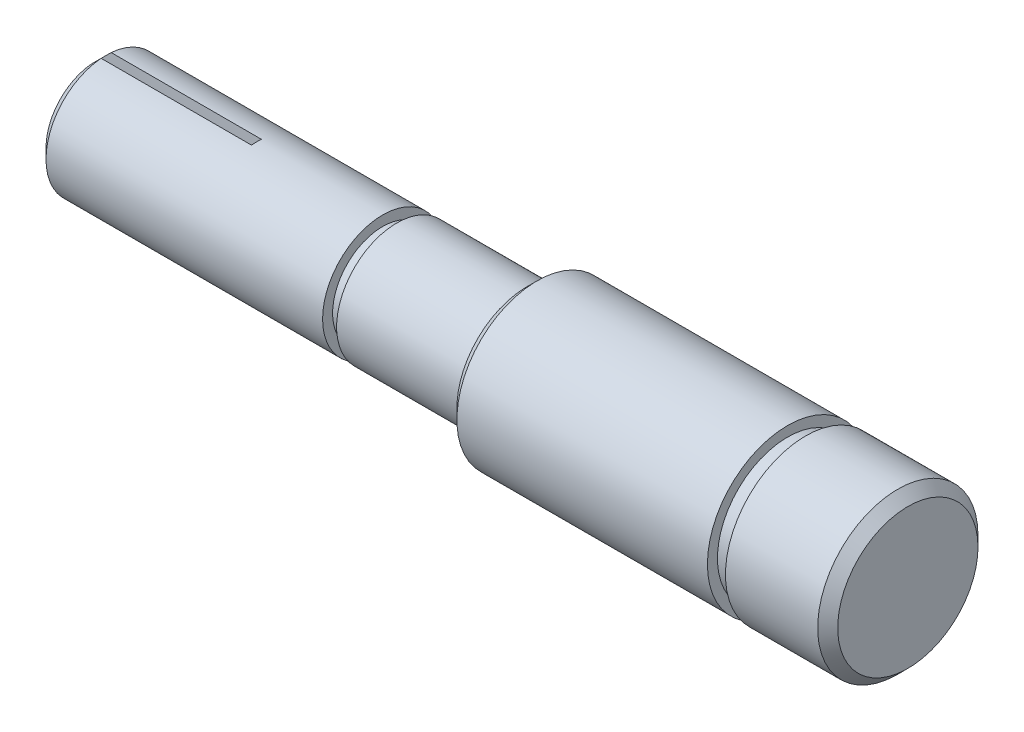
ISO-10303-21;
HEADER;
FILE_DESCRIPTION(('STEP AP214'),'2;1');
FILE_NAME('part.step','',(''),(''),'','','');
FILE_SCHEMA(('AUTOMOTIVE_DESIGN { 1 0 10303 214 1 1 1 1 }'));
ENDSEC;
DATA;
#1=APPLICATION_CONTEXT('core data for automotive mechanical design processes');
#2=APPLICATION_PROTOCOL_DEFINITION('international standard','automotive_design',2000,#1);
#3=PRODUCT_CONTEXT('',#1,'mechanical');
#4=PRODUCT('Part','Part','',(#3));
#5=PRODUCT_RELATED_PRODUCT_CATEGORY('part','',(#4));
#6=PRODUCT_DEFINITION_FORMATION('','',#4);
#7=PRODUCT_DEFINITION_CONTEXT('part definition',#1,'design');
#8=PRODUCT_DEFINITION('design','',#6,#7);
#9=PRODUCT_DEFINITION_SHAPE('','',#8);
#10=(LENGTH_UNIT() NAMED_UNIT(*) SI_UNIT(.MILLI.,.METRE.));
#11=(NAMED_UNIT(*) PLANE_ANGLE_UNIT() SI_UNIT($,.RADIAN.));
#12=(NAMED_UNIT(*) SI_UNIT($,.STERADIAN.) SOLID_ANGLE_UNIT());
#13=UNCERTAINTY_MEASURE_WITH_UNIT(LENGTH_MEASURE(1.E-05),#10,'distance_accuracy_value','');
#14=(GEOMETRIC_REPRESENTATION_CONTEXT(3) GLOBAL_UNCERTAINTY_ASSIGNED_CONTEXT((#13)) GLOBAL_UNIT_ASSIGNED_CONTEXT((#10,
#11,#12)) REPRESENTATION_CONTEXT('',''));
#15=CARTESIAN_POINT('',(0.,0.,0.));
#16=DIRECTION('',(0.,0.,1.));
#17=DIRECTION('',(1.,0.,0.));
#18=AXIS2_PLACEMENT_3D('',#15,#16,#17);
#19=CARTESIAN_POINT('',(-21.5,0.,0.));
#20=DIRECTION('',(1.,0.,0.));
#21=DIRECTION('',(0.,0.,-1.));
#22=AXIS2_PLACEMENT_3D('',#19,#20,#21);
#23=CONICAL_SURFACE('',#22,2.5,0.785398163397448);
#24=CARTESIAN_POINT('',(-21.,0.,0.));
#25=DIRECTION('',(1.,0.,0.));
#26=DIRECTION('',(0.,0.,-1.));
#27=AXIS2_PLACEMENT_3D('',#24,#25,#26);
#28=CIRCLE('',#27,3.);
#29=CARTESIAN_POINT('',(-21.,2.98956518577535,0.250000000000004));
#30=VERTEX_POINT('',#29);
#31=CARTESIAN_POINT('',(-21.,-2.98956518577535,0.250000000000004));
#32=VERTEX_POINT('',#31);
#33=EDGE_CURVE('E228',#30,#32,#28,.T.);
#34=ORIENTED_EDGE('',*,*,#33,.F.);
#35=CARTESIAN_POINT('',(-20.9993,2.9902676284908,0.250000000000004));
#36=CARTESIAN_POINT('',(-21.105645963465,2.88354717231607,0.250000000000004));
#37=CARTESIAN_POINT('',(-21.2119753631983,2.77681018083753,0.250000000000004));
#38=CARTESIAN_POINT('',(-21.4245834325751,2.56327423349095,0.250000000000004));
#39=CARTESIAN_POINT('',(-21.5308620991754,2.45647527459325,0.250000000000004));
#40=CARTESIAN_POINT('',(-21.7434767398393,2.24266011461647,0.250000000000004));
#41=CARTESIAN_POINT('',(-21.8498126108472,2.13564381105248,0.250000000000004));
#42=CARTESIAN_POINT('',(-22.0623554592259,1.92149432900575,0.250000000000004));
#43=CARTESIAN_POINT('',(-22.1685624430605,1.81436115694293,0.250000000000004));
#44=CARTESIAN_POINT('',(-22.3747364463565,1.60598729070477,0.250000000000004));
#45=CARTESIAN_POINT('',(-22.4747149031306,1.50475791122002,0.250000000000004));
#46=CARTESIAN_POINT('',(-22.6743690359422,1.30197014758938,0.250000000000004));
#47=CARTESIAN_POINT('',(-22.7740446642128,1.20041171628052,0.250000000000004));
#48=CARTESIAN_POINT('',(-22.9230171326216,1.04762350697907,0.250000000000004));
#49=CARTESIAN_POINT('',(-22.972565318899,0.996638901226536,0.250000000000004));
#50=CARTESIAN_POINT('',(-23.0714006562001,0.894410835579374,0.250000000000004));
#51=CARTESIAN_POINT('',(-23.1206877922016,0.843167361112515,0.250000000000004));
#52=CARTESIAN_POINT('',(-23.2188054598471,0.740272773730992,0.250000000000004));
#53=CARTESIAN_POINT('',(-23.2676361148001,0.688621778285208,0.250000000000004));
#54=CARTESIAN_POINT('',(-23.3645022948835,0.58458100683293,0.250000000000004));
#55=CARTESIAN_POINT('',(-23.4125379181739,0.532191323531495,0.250000000000004));
#56=CARTESIAN_POINT('',(-23.472835835936,0.464162293825563,0.250000000000004));
#57=CARTESIAN_POINT('',(-23.4859226134034,0.449257017395822,0.250000000000004));
#58=CARTESIAN_POINT('',(-23.511903307144,0.419277890756481,0.250000000000004));
#59=CARTESIAN_POINT('',(-23.5247972040769,0.40420402390347,0.250000000000004));
#60=CARTESIAN_POINT('',(-23.5633586086666,0.358382247513215,0.250000000000004));
#61=CARTESIAN_POINT('',(-23.5886555582303,0.327312762945882,0.250000000000004));
#62=CARTESIAN_POINT('',(-23.6252382522476,0.27937697350762,0.250000000000004));
#63=CARTESIAN_POINT('',(-23.6372682333789,0.263082275343485,0.250000000000004));
#64=CARTESIAN_POINT('',(-23.6605395199735,0.229943029382785,0.250000000000004));
#65=CARTESIAN_POINT('',(-23.6717812008072,0.213098748961249,0.250000000000004));
#66=CARTESIAN_POINT('',(-23.692948155577,0.178779798046501,0.250000000000004));
#67=CARTESIAN_POINT('',(-23.7028835753176,0.161311515415135,0.250000000000004));
#68=CARTESIAN_POINT('',(-23.7207464504694,0.125398009318636,0.250000000000004));
#69=CARTESIAN_POINT('',(-23.728679850279,0.106955879401266,0.250000000000004));
#70=CARTESIAN_POINT('',(-23.7407373861175,0.0705858498257445,0.250000000000004));
#71=CARTESIAN_POINT('',(-23.7451342674538,0.0527543486405554,0.250000000000004));
#72=CARTESIAN_POINT('',(-23.7500737813293,0.0166357412634052,0.250000000000004));
#73=CARTESIAN_POINT('',(-23.7506414543594,-0.00164761864048112,0.250000000000004));
#74=CARTESIAN_POINT('',(-23.7478030329323,-0.0378228582444066,0.250000000000004));
#75=CARTESIAN_POINT('',(-23.744407646743,-0.0557156604188548,0.250000000000004));
#76=CARTESIAN_POINT('',(-23.7345832748863,-0.090744359528676,0.250000000000004));
#77=CARTESIAN_POINT('',(-23.7281292768153,-0.107872717633599,0.250000000000004));
#78=CARTESIAN_POINT('',(-23.7144440025326,-0.138562346567691,0.250000000000004));
#79=CARTESIAN_POINT('',(-23.7074996814289,-0.152257626430681,0.250000000000004));
#80=CARTESIAN_POINT('',(-23.6926545987555,-0.179125666838547,0.250000000000004));
#81=CARTESIAN_POINT('',(-23.6847531211403,-0.192298026285365,0.250000000000004));
#82=CARTESIAN_POINT('',(-23.6600273622829,-0.231281435604873,0.250000000000004));
#83=CARTESIAN_POINT('',(-23.6422283688442,-0.256466072633681,0.250000000000004));
#84=CARTESIAN_POINT('',(-23.60516056709,-0.306049112889524,0.250000000000004));
#85=CARTESIAN_POINT('',(-23.5858799223633,-0.330438346273076,0.250000000000004));
#86=CARTESIAN_POINT('',(-23.54658106566,-0.378521417099532,0.250000000000004));
#87=CARTESIAN_POINT('',(-23.526564611432,-0.402216696148967,0.250000000000004));
#88=CARTESIAN_POINT('',(-23.4666751471882,-0.471685248942617,0.250000000000004));
#89=CARTESIAN_POINT('',(-23.4261362735594,-0.516879799009654,0.250000000000004));
#90=CARTESIAN_POINT('',(-23.3442258007109,-0.606512128707194,0.250000000000004));
#91=CARTESIAN_POINT('',(-23.3028540504337,-0.650949768310156,0.250000000000004));
#92=CARTESIAN_POINT('',(-23.2195907474666,-0.739434846645634,0.250000000000004));
#93=CARTESIAN_POINT('',(-23.1776986357934,-0.783481759281574,0.250000000000004));
#94=CARTESIAN_POINT('',(-23.0936325608451,-0.871297933709806,0.250000000000004));
#95=CARTESIAN_POINT('',(-23.0514586209597,-0.915067217969552,0.250000000000004));
#96=CARTESIAN_POINT('',(-22.9254318394301,-1.04531491722678,0.250000000000004));
#97=CARTESIAN_POINT('',(-22.8413115903939,-1.13153440795978,0.250000000000004));
#98=CARTESIAN_POINT('',(-22.6727605317382,-1.30359134564105,0.250000000000004));
#99=CARTESIAN_POINT('',(-22.5883298806817,-1.38942894844638,0.250000000000004));
#100=CARTESIAN_POINT('',(-22.3795603854613,-1.60117963916256,0.250000000000004));
#101=CARTESIAN_POINT('',(-22.2551047929327,-1.72697761830093,0.250000000000004));
#102=CARTESIAN_POINT('',(-22.0059548291957,-1.97838000922704,0.250000000000004));
#103=CARTESIAN_POINT('',(-21.8812604201732,-2.10398438348348,0.250000000000004));
#104=CARTESIAN_POINT('',(-21.63039117078,-2.35642720390123,0.250000000000004));
#105=CARTESIAN_POINT('',(-21.5042149370849,-2.48326426543281,0.250000000000004));
#106=CARTESIAN_POINT('',(-21.2517992913905,-2.73683025270886,0.250000000000004));
#107=CARTESIAN_POINT('',(-21.1255598947718,-2.86355919376233,0.250000000000004));
#108=CARTESIAN_POINT('',(-20.9993,-2.9902676284908,0.250000000000004));
#109=B_SPLINE_CURVE_WITH_KNOTS('',3,(#35,#36,#37,#38,#39,#40,#41,#42,#43,#44,#45,#46,#47,#48,
#49,#50,#51,#52,#53,#54,#55,#56,#57,#58,#59,#60,#61,#62,#63,#64,#65,#66,#67,#68,#69,#70,#71,#72,
#73,#74,#75,#76,#77,#78,#79,#80,#81,#82,#83,#84,#85,#86,#87,#88,#89,#90,#91,#92,#93,#94,#95,#96,
#97,#98,#99,#100,#101,#102,#103,#104,#105,#106,#107,#108),.UNSPECIFIED.,.F.,.F.,(4,2,2,2,2,2,2,
2,2,2,2,2,2,2,2,2,2,2,2,2,2,2,2,2,2,2,2,2,2,2,2,2,2,2,2,2,4),(0.,0.45198286086596,
0.903990082435561,1.35658065177219,1.80914749886992,2.23598189484333,2.66288044451171,
2.87616409412312,3.08945988673875,3.30269629260739,3.51590617145908,3.57540954944727,
3.63491885444813,3.75506085917041,3.81580973111918,3.87652947659987,3.93674556704951,
3.99678070249662,4.0515584273213,4.10597759180221,4.16025005432108,4.21497420761324,
4.26099326898474,4.30704697217485,4.39946400695503,4.49271680144073,4.58575970768695,
4.76786892204766,4.95001146828919,5.13237033416576,5.3147142491403,5.67608412992546,
6.03728973414596,6.56816461830996,7.09913196845889,7.63585598578533,8.17248378661414),.UNSPECIFIED.);
#110=CARTESIAN_POINT('',(-21.5,2.48746859276655,0.250000000000004));
#111=VERTEX_POINT('',#110);
#112=EDGE_CURVE('E72',#30,#111,#109,.T.);
#113=ORIENTED_EDGE('',*,*,#112,.T.);
#114=CARTESIAN_POINT('',(-21.5,0.,0.));
#115=DIRECTION('',(1.,0.,0.));
#116=DIRECTION('',(0.,0.,-1.));
#117=AXIS2_PLACEMENT_3D('',#114,#115,#116);
#118=CIRCLE('',#117,2.5);
#119=CARTESIAN_POINT('',(-21.5,-2.48746859276655,0.250000000000004));
#120=VERTEX_POINT('',#119);
#121=EDGE_CURVE('E238',#111,#120,#118,.T.);
#122=ORIENTED_EDGE('',*,*,#121,.T.);
#123=EDGE_CURVE('E138',#120,#32,#109,.T.);
#124=ORIENTED_EDGE('',*,*,#123,.T.);
#125=EDGE_LOOP('',(#34,#113,#122,#124));
#126=FACE_BOUND('',#125,.T.);
#127=ADVANCED_FACE('F49',(#126),#23,.T.);
#128=CARTESIAN_POINT('',(-21.5,0.,0.));
#129=DIRECTION('',(1.,0.,0.));
#130=DIRECTION('',(0.,0.,-1.));
#131=AXIS2_PLACEMENT_3D('',#128,#129,#130);
#132=PLANE('',#131);
#133=ORIENTED_EDGE('',*,*,#121,.F.);
#134=DIRECTION('',(0.,-1.,0.));
#135=VECTOR('',#134,1.);
#136=CARTESIAN_POINT('',(-21.5,0.,0.250000000000004));
#137=LINE('',#136,#135);
#138=EDGE_CURVE('E11',#111,#120,#137,.T.);
#139=ORIENTED_EDGE('',*,*,#138,.T.);
#140=EDGE_LOOP('',(#133,#139));
#141=FACE_BOUND('',#140,.T.);
#142=ADVANCED_FACE('F158',(#141),#132,.F.);
#143=CARTESIAN_POINT('',(19.,0.,0.));
#144=DIRECTION('',(1.,0.,0.));
#145=DIRECTION('',(0.,0.,-1.));
#146=AXIS2_PLACEMENT_3D('',#143,#144,#145);
#147=CYLINDRICAL_SURFACE('',#146,4.);
#148=CARTESIAN_POINT('',(13.,0.,0.));
#149=DIRECTION('',(-1.,0.,0.));
#150=DIRECTION('',(0.,0.,1.));
#151=AXIS2_PLACEMENT_3D('',#148,#149,#150);
#152=CIRCLE('',#151,4.);
#153=CARTESIAN_POINT('',(13.,0.,4.));
#154=VERTEX_POINT('',#153);
#155=EDGE_CURVE('E243',#154,#154,#152,.T.);
#156=ORIENTED_EDGE('',*,*,#155,.T.);
#157=EDGE_LOOP('',(#156));
#158=FACE_BOUND('',#157,.T.);
#159=CARTESIAN_POINT('',(0.5,0.,0.));
#160=DIRECTION('',(1.,0.,0.));
#161=DIRECTION('',(0.,0.,-1.));
#162=AXIS2_PLACEMENT_3D('',#159,#160,#161);
#163=CIRCLE('',#162,4.);
#164=CARTESIAN_POINT('',(0.5,0.,-4.));
#165=VERTEX_POINT('',#164);
#166=EDGE_CURVE('E245',#165,#165,#163,.T.);
#167=ORIENTED_EDGE('',*,*,#166,.T.);
#168=EDGE_LOOP('',(#167));
#169=FACE_BOUND('',#168,.T.);
#170=ADVANCED_FACE('F154',(#158,#169),#147,.T.);
#171=CARTESIAN_POINT('',(13.,8.,0.));
#172=DIRECTION('',(-1.,0.,0.));
#173=DIRECTION('',(0.,0.,1.));
#174=AXIS2_PLACEMENT_3D('',#171,#172,#173);
#175=PLANE('',#174);
#176=CARTESIAN_POINT('',(13.,0.,0.));
#177=DIRECTION('',(1.,0.,0.));
#178=DIRECTION('',(0.,0.,-1.));
#179=AXIS2_PLACEMENT_3D('',#176,#177,#178);
#180=CIRCLE('',#179,3.5);
#181=CARTESIAN_POINT('',(13.,0.,-3.5));
#182=VERTEX_POINT('',#181);
#183=EDGE_CURVE('E248',#182,#182,#180,.T.);
#184=ORIENTED_EDGE('',*,*,#183,.F.);
#185=EDGE_LOOP('',(#184));
#186=FACE_BOUND('',#185,.T.);
#187=ORIENTED_EDGE('',*,*,#155,.F.);
#188=EDGE_LOOP('',(#187));
#189=FACE_BOUND('',#188,.T.);
#190=ADVANCED_FACE('F157',(#186,#189),#175,.F.);
#191=CARTESIAN_POINT('',(0.,0.,0.));
#192=DIRECTION('',(1.,0.,0.));
#193=DIRECTION('',(0.,0.,-1.));
#194=AXIS2_PLACEMENT_3D('',#191,#192,#193);
#195=CONICAL_SURFACE('',#194,3.5,0.785398163397448);
#196=ORIENTED_EDGE('',*,*,#166,.F.);
#197=EDGE_LOOP('',(#196));
#198=FACE_BOUND('',#197,.T.);
#199=CARTESIAN_POINT('',(0.,0.,0.));
#200=DIRECTION('',(1.,0.,0.));
#201=DIRECTION('',(0.,0.,-1.));
#202=AXIS2_PLACEMENT_3D('',#199,#200,#201);
#203=CIRCLE('',#202,3.5);
#204=CARTESIAN_POINT('',(0.,0.,-3.5));
#205=VERTEX_POINT('',#204);
#206=EDGE_CURVE('E253',#205,#205,#203,.T.);
#207=ORIENTED_EDGE('',*,*,#206,.T.);
#208=EDGE_LOOP('',(#207));
#209=FACE_BOUND('',#208,.T.);
#210=ADVANCED_FACE('F163',(#198,#209),#195,.T.);
#211=CARTESIAN_POINT('',(19.,0.,0.));
#212=DIRECTION('',(1.,0.,0.));
#213=DIRECTION('',(0.,0.,-1.));
#214=AXIS2_PLACEMENT_3D('',#211,#212,#213);
#215=CYLINDRICAL_SURFACE('',#214,3.5);
#216=CARTESIAN_POINT('',(13.9,0.,0.));
#217=DIRECTION('',(1.,0.,0.));
#218=DIRECTION('',(0.,0.,-1.));
#219=AXIS2_PLACEMENT_3D('',#216,#217,#218);
#220=CIRCLE('',#219,3.5);
#221=CARTESIAN_POINT('',(13.9,0.,-3.5));
#222=VERTEX_POINT('',#221);
#223=EDGE_CURVE('E256',#222,#222,#220,.T.);
#224=ORIENTED_EDGE('',*,*,#223,.F.);
#225=EDGE_LOOP('',(#224));
#226=FACE_BOUND('',#225,.T.);
#227=ORIENTED_EDGE('',*,*,#183,.T.);
#228=EDGE_LOOP('',(#227));
#229=FACE_BOUND('',#228,.T.);
#230=ADVANCED_FACE('F167',(#226,#229),#215,.T.);
#231=CARTESIAN_POINT('',(0.,3.2,0.));
#232=DIRECTION('',(1.,0.,0.));
#233=DIRECTION('',(0.,0.,-1.));
#234=AXIS2_PLACEMENT_3D('',#231,#232,#233);
#235=PLANE('',#234);
#236=ORIENTED_EDGE('',*,*,#206,.F.);
#237=EDGE_LOOP('',(#236));
#238=FACE_BOUND('',#237,.T.);
#239=CARTESIAN_POINT('',(0.,0.,0.));
#240=DIRECTION('',(1.,0.,0.));
#241=DIRECTION('',(0.,0.,-1.));
#242=AXIS2_PLACEMENT_3D('',#239,#240,#241);
#243=CIRCLE('',#242,3.2);
#244=CARTESIAN_POINT('',(0.,0.,-3.2));
#245=VERTEX_POINT('',#244);
#246=EDGE_CURVE('E259',#245,#245,#243,.T.);
#247=ORIENTED_EDGE('',*,*,#246,.T.);
#248=EDGE_LOOP('',(#247));
#249=FACE_BOUND('',#248,.T.);
#250=ADVANCED_FACE('F171',(#238,#249),#235,.F.);
#251=CARTESIAN_POINT('',(13.9,3.5,0.));
#252=DIRECTION('',(1.,0.,0.));
#253=DIRECTION('',(0.,0.,-1.));
#254=AXIS2_PLACEMENT_3D('',#251,#252,#253);
#255=PLANE('',#254);
#256=CARTESIAN_POINT('',(13.9,0.,0.));
#257=DIRECTION('',(1.,0.,0.));
#258=DIRECTION('',(0.,0.,-1.));
#259=AXIS2_PLACEMENT_3D('',#256,#257,#258);
#260=CIRCLE('',#259,4.);
#261=CARTESIAN_POINT('',(13.9,0.,-4.));
#262=VERTEX_POINT('',#261);
#263=EDGE_CURVE('E262',#262,#262,#260,.T.);
#264=ORIENTED_EDGE('',*,*,#263,.F.);
#265=EDGE_LOOP('',(#264));
#266=FACE_BOUND('',#265,.T.);
#267=ORIENTED_EDGE('',*,*,#223,.T.);
#268=EDGE_LOOP('',(#267));
#269=FACE_BOUND('',#268,.T.);
#270=ADVANCED_FACE('F175',(#266,#269),#255,.F.);
#271=CARTESIAN_POINT('',(-0.200000000000019,0.,0.));
#272=DIRECTION('',(1.,0.,0.));
#273=DIRECTION('',(0.,0.,-1.));
#274=AXIS2_PLACEMENT_3D('',#271,#272,#273);
#275=TOROIDAL_SURFACE('',#274,3.2,0.200000000000019);
#276=ORIENTED_EDGE('',*,*,#246,.F.);
#277=EDGE_LOOP('',(#276));
#278=FACE_BOUND('',#277,.T.);
#279=CARTESIAN_POINT('',(-0.2,0.,0.));
#280=DIRECTION('',(1.,0.,0.));
#281=DIRECTION('',(0.,0.,-1.));
#282=AXIS2_PLACEMENT_3D('',#279,#280,#281);
#283=CIRCLE('',#282,3.);
#284=CARTESIAN_POINT('',(-0.2,0.,-3.));
#285=VERTEX_POINT('',#284);
#286=EDGE_CURVE('E265',#285,#285,#283,.T.);
#287=ORIENTED_EDGE('',*,*,#286,.T.);
#288=EDGE_LOOP('',(#287));
#289=FACE_BOUND('',#288,.T.);
#290=ADVANCED_FACE('F179',(#278,#289),#275,.F.);
#291=CARTESIAN_POINT('',(18.5,0.,0.));
#292=DIRECTION('',(1.,0.,0.));
#293=DIRECTION('',(0.,0.,-1.));
#294=AXIS2_PLACEMENT_3D('',#291,#292,#293);
#295=CIRCLE('',#294,4.);
#296=CARTESIAN_POINT('',(18.5,0.,-4.));
#297=VERTEX_POINT('',#296);
#298=EDGE_CURVE('E268',#297,#297,#295,.T.);
#299=ORIENTED_EDGE('',*,*,#298,.F.);
#300=EDGE_LOOP('',(#299));
#301=FACE_BOUND('',#300,.T.);
#302=ORIENTED_EDGE('',*,*,#263,.T.);
#303=EDGE_LOOP('',(#302));
#304=FACE_BOUND('',#303,.T.);
#305=ADVANCED_FACE('F160',(#301,#304),#147,.T.);
#306=CARTESIAN_POINT('',(19.,0.,0.));
#307=DIRECTION('',(1.,0.,0.));
#308=DIRECTION('',(0.,0.,-1.));
#309=AXIS2_PLACEMENT_3D('',#306,#307,#308);
#310=CYLINDRICAL_SURFACE('',#309,3.);
#311=ORIENTED_EDGE('',*,*,#286,.F.);
#312=EDGE_LOOP('',(#311));
#313=FACE_BOUND('',#312,.T.);
#314=CARTESIAN_POINT('',(-6.5,0.,0.));
#315=DIRECTION('',(1.,0.,0.));
#316=DIRECTION('',(0.,0.,-1.));
#317=AXIS2_PLACEMENT_3D('',#314,#315,#316);
#318=CIRCLE('',#317,3.);
#319=CARTESIAN_POINT('',(-6.5,0.,-3.));
#320=VERTEX_POINT('',#319);
#321=EDGE_CURVE('E271',#320,#320,#318,.T.);
#322=ORIENTED_EDGE('',*,*,#321,.T.);
#323=EDGE_LOOP('',(#322));
#324=FACE_BOUND('',#323,.T.);
#325=ADVANCED_FACE('F184',(#313,#324),#310,.T.);
#326=CARTESIAN_POINT('',(18.5,0.,0.));
#327=DIRECTION('',(-1.,0.,0.));
#328=DIRECTION('',(0.,0.,1.));
#329=AXIS2_PLACEMENT_3D('',#326,#327,#328);
#330=CONICAL_SURFACE('',#329,4.,0.785398163397448);
#331=CARTESIAN_POINT('',(19.,0.,0.));
#332=DIRECTION('',(1.,0.,0.));
#333=DIRECTION('',(0.,0.,-1.));
#334=AXIS2_PLACEMENT_3D('',#331,#332,#333);
#335=CIRCLE('',#334,3.5);
#336=CARTESIAN_POINT('',(19.,0.,-3.5));
#337=VERTEX_POINT('',#336);
#338=EDGE_CURVE('E274',#337,#337,#335,.T.);
#339=ORIENTED_EDGE('',*,*,#338,.F.);
#340=EDGE_LOOP('',(#339));
#341=FACE_BOUND('',#340,.T.);
#342=ORIENTED_EDGE('',*,*,#298,.T.);
#343=EDGE_LOOP('',(#342));
#344=FACE_BOUND('',#343,.T.);
#345=ADVANCED_FACE('F187',(#341,#344),#330,.T.);
#346=CARTESIAN_POINT('',(-6.5,2.5,0.));
#347=DIRECTION('',(1.,0.,0.));
#348=DIRECTION('',(0.,0.,-1.));
#349=AXIS2_PLACEMENT_3D('',#346,#347,#348);
#350=PLANE('',#349);
#351=ORIENTED_EDGE('',*,*,#321,.F.);
#352=EDGE_LOOP('',(#351));
#353=FACE_BOUND('',#352,.T.);
#354=CARTESIAN_POINT('',(-6.5,0.,0.));
#355=DIRECTION('',(1.,0.,0.));
#356=DIRECTION('',(0.,0.,-1.));
#357=AXIS2_PLACEMENT_3D('',#354,#355,#356);
#358=CIRCLE('',#357,2.5);
#359=CARTESIAN_POINT('',(-6.5,0.,-2.5));
#360=VERTEX_POINT('',#359);
#361=EDGE_CURVE('E277',#360,#360,#358,.T.);
#362=ORIENTED_EDGE('',*,*,#361,.T.);
#363=EDGE_LOOP('',(#362));
#364=FACE_BOUND('',#363,.T.);
#365=ADVANCED_FACE('F191',(#353,#364),#350,.F.);
#366=CARTESIAN_POINT('',(19.,3.5,0.));
#367=DIRECTION('',(-1.,0.,0.));
#368=DIRECTION('',(0.,0.,1.));
#369=AXIS2_PLACEMENT_3D('',#366,#367,#368);
#370=PLANE('',#369);
#371=ORIENTED_EDGE('',*,*,#338,.T.);
#372=EDGE_LOOP('',(#371));
#373=FACE_BOUND('',#372,.T.);
#374=ADVANCED_FACE('F195',(#373),#370,.F.);
#375=CARTESIAN_POINT('',(21.5,0.,0.));
#376=DIRECTION('',(1.,0.,0.));
#377=DIRECTION('',(0.,0.,-1.));
#378=AXIS2_PLACEMENT_3D('',#375,#376,#377);
#379=CYLINDRICAL_SURFACE('',#378,2.5);
#380=ORIENTED_EDGE('',*,*,#361,.F.);
#381=EDGE_LOOP('',(#380));
#382=FACE_BOUND('',#381,.T.);
#383=CARTESIAN_POINT('',(-7.2,0.,0.));
#384=DIRECTION('',(1.,0.,0.));
#385=DIRECTION('',(0.,0.,-1.));
#386=AXIS2_PLACEMENT_3D('',#383,#384,#385);
#387=CIRCLE('',#386,2.5);
#388=CARTESIAN_POINT('',(-7.2,0.,-2.5));
#389=VERTEX_POINT('',#388);
#390=EDGE_CURVE('E234',#389,#389,#387,.T.);
#391=ORIENTED_EDGE('',*,*,#390,.T.);
#392=EDGE_LOOP('',(#391));
#393=FACE_BOUND('',#392,.T.);
#394=ADVANCED_FACE('F199',(#382,#393),#379,.T.);
#395=CARTESIAN_POINT('',(-7.2,6.,0.));
#396=DIRECTION('',(-1.,0.,0.));
#397=DIRECTION('',(0.,0.,1.));
#398=AXIS2_PLACEMENT_3D('',#395,#396,#397);
#399=PLANE('',#398);
#400=ORIENTED_EDGE('',*,*,#390,.F.);
#401=EDGE_LOOP('',(#400));
#402=FACE_BOUND('',#401,.T.);
#403=CARTESIAN_POINT('',(-7.2,0.,0.));
#404=DIRECTION('',(-1.,0.,0.));
#405=DIRECTION('',(0.,0.,1.));
#406=AXIS2_PLACEMENT_3D('',#403,#404,#405);
#407=CIRCLE('',#406,3.);
#408=CARTESIAN_POINT('',(-7.2,0.,3.));
#409=VERTEX_POINT('',#408);
#410=EDGE_CURVE('E229',#409,#409,#407,.T.);
#411=ORIENTED_EDGE('',*,*,#410,.F.);
#412=EDGE_LOOP('',(#411));
#413=FACE_BOUND('',#412,.T.);
#414=ADVANCED_FACE('F202',(#402,#413),#399,.F.);
#415=CARTESIAN_POINT('',(-13.5,0.,0.));
#416=DIRECTION('',(-1.,0.,0.));
#417=DIRECTION('',(0.,0.,-1.));
#418=AXIS2_PLACEMENT_3D('',#415,#416,#417);
#419=CIRCLE('',#418,3.);
#420=CARTESIAN_POINT('',(-13.5,2.98956518577535,0.250000000000004));
#421=VERTEX_POINT('',#420);
#422=CARTESIAN_POINT('',(-13.5,2.98956518577535,-0.249999999999996));
#423=VERTEX_POINT('',#422);
#424=EDGE_CURVE('E110',#421,#423,#419,.T.);
#425=ORIENTED_EDGE('',*,*,#424,.F.);
#426=DIRECTION('',(-1.,0.,0.));
#427=VECTOR('',#426,1.);
#428=CARTESIAN_POINT('',(-13.5,2.98956518577535,0.250000000000004));
#429=LINE('',#428,#427);
#430=EDGE_CURVE('E137',#421,#30,#429,.T.);
#431=ORIENTED_EDGE('',*,*,#430,.T.);
#432=ORIENTED_EDGE('',*,*,#33,.T.);
#433=DIRECTION('',(-1.,0.,0.));
#434=VECTOR('',#433,1.);
#435=CARTESIAN_POINT('',(-13.5,-2.98956518577535,0.250000000000004));
#436=LINE('',#435,#434);
#437=CARTESIAN_POINT('',(-13.5,-2.98956518577535,0.250000000000004));
#438=VERTEX_POINT('',#437);
#439=EDGE_CURVE('E125',#438,#32,#436,.T.);
#440=ORIENTED_EDGE('',*,*,#439,.F.);
#441=CARTESIAN_POINT('',(-13.5,0.,0.));
#442=DIRECTION('',(-1.,0.,0.));
#443=DIRECTION('',(0.,0.,1.));
#444=AXIS2_PLACEMENT_3D('',#441,#442,#443);
#445=CIRCLE('',#444,3.);
#446=CARTESIAN_POINT('',(-13.5,-2.98956518577535,-0.249999999999996));
#447=VERTEX_POINT('',#446);
#448=EDGE_CURVE('E109',#447,#438,#445,.T.);
#449=ORIENTED_EDGE('',*,*,#448,.F.);
#450=DIRECTION('',(-1.,0.,0.));
#451=VECTOR('',#450,1.);
#452=CARTESIAN_POINT('',(-13.5,-2.98956518577535,-0.249999999999996));
#453=LINE('',#452,#451);
#454=CARTESIAN_POINT('',(-21.,-2.98956518577535,-0.249999999999996));
#455=VERTEX_POINT('',#454);
#456=EDGE_CURVE('E106',#447,#455,#453,.T.);
#457=ORIENTED_EDGE('',*,*,#456,.T.);
#458=CARTESIAN_POINT('',(-21.,2.98956518577535,-0.249999999999996));
#459=VERTEX_POINT('',#458);
#460=EDGE_CURVE('E123',#455,#459,#28,.T.);
#461=ORIENTED_EDGE('',*,*,#460,.T.);
#462=DIRECTION('',(-1.,0.,0.));
#463=VECTOR('',#462,1.);
#464=CARTESIAN_POINT('',(-13.5,2.98956518577535,-0.249999999999996));
#465=LINE('',#464,#463);
#466=EDGE_CURVE('E104',#423,#459,#465,.T.);
#467=ORIENTED_EDGE('',*,*,#466,.F.);
#468=EDGE_LOOP('',(#425,#431,#432,#440,#449,#457,#461,#467));
#469=FACE_BOUND('',#468,.T.);
#470=ORIENTED_EDGE('',*,*,#410,.T.);
#471=EDGE_LOOP('',(#470));
#472=FACE_BOUND('',#471,.T.);
#473=ADVANCED_FACE('F120',(#469,#472),#310,.T.);
#474=ORIENTED_EDGE('',*,*,#460,.F.);
#475=CARTESIAN_POINT('',(-20.9993,-2.9902676284908,-0.249999999999996));
#476=CARTESIAN_POINT('',(-21.105645963465,-2.88354717231607,-0.249999999999996));
#477=CARTESIAN_POINT('',(-21.2119753631983,-2.77681018083753,-0.249999999999996));
#478=CARTESIAN_POINT('',(-21.4245834325751,-2.56327423349095,-0.249999999999996));
#479=CARTESIAN_POINT('',(-21.5308620991754,-2.45647527459326,-0.249999999999996));
#480=CARTESIAN_POINT('',(-21.7434767398393,-2.24266011461647,-0.249999999999996));
#481=CARTESIAN_POINT('',(-21.8498126108472,-2.13564381105249,-0.249999999999996));
#482=CARTESIAN_POINT('',(-22.0623554592259,-1.92149432900575,-0.249999999999996));
#483=CARTESIAN_POINT('',(-22.1685624430605,-1.81436115694293,-0.249999999999996));
#484=CARTESIAN_POINT('',(-22.3747364463565,-1.60598729070477,-0.249999999999996));
#485=CARTESIAN_POINT('',(-22.4747149031306,-1.50475791122003,-0.249999999999996));
#486=CARTESIAN_POINT('',(-22.6743690359422,-1.30197014758939,-0.249999999999996));
#487=CARTESIAN_POINT('',(-22.7740446642128,-1.20041171628053,-0.249999999999996));
#488=CARTESIAN_POINT('',(-22.9230171326216,-1.04762350697908,-0.249999999999996));
#489=CARTESIAN_POINT('',(-22.972565318899,-0.99663890122654,-0.249999999999996));
#490=CARTESIAN_POINT('',(-23.0714006562001,-0.894410835579378,-0.249999999999996));
#491=CARTESIAN_POINT('',(-23.1206877922016,-0.843167361112519,-0.249999999999996));
#492=CARTESIAN_POINT('',(-23.2188054598471,-0.740272773730995,-0.249999999999996));
#493=CARTESIAN_POINT('',(-23.2676361148001,-0.68862177828521,-0.249999999999996));
#494=CARTESIAN_POINT('',(-23.3645022948835,-0.584581006832933,-0.249999999999996));
#495=CARTESIAN_POINT('',(-23.4125379181739,-0.532191323531498,-0.249999999999996));
#496=CARTESIAN_POINT('',(-23.472835835936,-0.464162293825568,-0.249999999999996));
#497=CARTESIAN_POINT('',(-23.4859226134034,-0.449257017395827,-0.249999999999996));
#498=CARTESIAN_POINT('',(-23.511903307144,-0.419277890756487,-0.249999999999996));
#499=CARTESIAN_POINT('',(-23.5247972040769,-0.404204023903477,-0.249999999999996));
#500=CARTESIAN_POINT('',(-23.5633586086666,-0.358382247513224,-0.249999999999996));
#501=CARTESIAN_POINT('',(-23.5886555582303,-0.327312762945888,-0.249999999999996));
#502=CARTESIAN_POINT('',(-23.6252382522476,-0.279376973507627,-0.249999999999996));
#503=CARTESIAN_POINT('',(-23.6372682333789,-0.263082275343492,-0.249999999999996));
#504=CARTESIAN_POINT('',(-23.6605395199735,-0.229943029382793,-0.249999999999996));
#505=CARTESIAN_POINT('',(-23.6717812008072,-0.213098748961258,-0.249999999999996));
#506=CARTESIAN_POINT('',(-23.692948155577,-0.178779798046511,-0.249999999999996));
#507=CARTESIAN_POINT('',(-23.7028835753176,-0.161311515415144,-0.249999999999996));
#508=CARTESIAN_POINT('',(-23.7207464504694,-0.125398009318646,-0.249999999999996));
#509=CARTESIAN_POINT('',(-23.728679850279,-0.106955879401276,-0.249999999999996));
#510=CARTESIAN_POINT('',(-23.7407373861176,-0.0705858498257543,-0.249999999999996));
#511=CARTESIAN_POINT('',(-23.7451342674538,-0.0527543486405649,-0.249999999999996));
#512=CARTESIAN_POINT('',(-23.7500737813293,-0.0166357412634145,-0.249999999999996));
#513=CARTESIAN_POINT('',(-23.7506414543594,0.00164761864047161,-0.249999999999996));
#514=CARTESIAN_POINT('',(-23.7478030329323,0.0378228582443975,-0.249999999999996));
#515=CARTESIAN_POINT('',(-23.744407646743,0.0557156604188461,-0.249999999999996));
#516=CARTESIAN_POINT('',(-23.7345832748863,0.0907443595286686,-0.249999999999996));
#517=CARTESIAN_POINT('',(-23.7281292768153,0.107872717633592,-0.249999999999996));
#518=CARTESIAN_POINT('',(-23.7144440025326,0.138562346567683,-0.249999999999996));
#519=CARTESIAN_POINT('',(-23.7074996814289,0.152257626430671,-0.249999999999996));
#520=CARTESIAN_POINT('',(-23.6926545987555,0.179125666838535,-0.249999999999996));
#521=CARTESIAN_POINT('',(-23.6847531211403,0.192298026285353,-0.249999999999996));
#522=CARTESIAN_POINT('',(-23.660027362283,0.231281435604858,-0.249999999999996));
#523=CARTESIAN_POINT('',(-23.6422283688442,0.256466072633663,-0.249999999999996));
#524=CARTESIAN_POINT('',(-23.6051605670901,0.3060491128895,-0.249999999999996));
#525=CARTESIAN_POINT('',(-23.5858799223633,0.33043834627305,-0.249999999999996));
#526=CARTESIAN_POINT('',(-23.54658106566,0.378521417099504,-0.249999999999996));
#527=CARTESIAN_POINT('',(-23.526564611432,0.402216696148938,-0.249999999999996));
#528=CARTESIAN_POINT('',(-23.4666751471883,0.471685248942586,-0.249999999999996));
#529=CARTESIAN_POINT('',(-23.4261362735594,0.516879799009619,-0.249999999999996));
#530=CARTESIAN_POINT('',(-23.344225800711,0.606512128707151,-0.249999999999996));
#531=CARTESIAN_POINT('',(-23.3028540504338,0.650949768310109,-0.249999999999996));
#532=CARTESIAN_POINT('',(-23.2195907474667,0.73943484664558,-0.249999999999996));
#533=CARTESIAN_POINT('',(-23.1776986357934,0.783481759281517,-0.249999999999996));
#534=CARTESIAN_POINT('',(-23.0936325608452,0.871297933709742,-0.249999999999996));
#535=CARTESIAN_POINT('',(-23.0514586209598,0.915067217969484,-0.249999999999996));
#536=CARTESIAN_POINT('',(-22.9254318394302,1.0453149172267,-0.249999999999996));
#537=CARTESIAN_POINT('',(-22.841311590394,1.13153440795969,-0.249999999999996));
#538=CARTESIAN_POINT('',(-22.6727605317383,1.30359134564095,-0.249999999999996));
#539=CARTESIAN_POINT('',(-22.5883298806818,1.38942894844628,-0.249999999999996));
#540=CARTESIAN_POINT('',(-22.3795603854614,1.60117963916247,-0.249999999999996));
#541=CARTESIAN_POINT('',(-22.2551047929328,1.72697761830084,-0.249999999999996));
#542=CARTESIAN_POINT('',(-22.0059548291958,1.97838000922697,-0.249999999999996));
#543=CARTESIAN_POINT('',(-21.8812604201733,2.10398438348342,-0.249999999999996));
#544=CARTESIAN_POINT('',(-21.63039117078,2.35642720390118,-0.249999999999996));
#545=CARTESIAN_POINT('',(-21.5042149370849,2.48326426543277,-0.249999999999996));
#546=CARTESIAN_POINT('',(-21.2517992913905,2.73683025270884,-0.249999999999996));
#547=CARTESIAN_POINT('',(-21.1255598947719,2.86355919376232,-0.249999999999996));
#548=CARTESIAN_POINT('',(-20.9993,2.9902676284908,-0.249999999999996));
#549=B_SPLINE_CURVE_WITH_KNOTS('',3,(#475,#476,#477,#478,#479,#480,#481,#482,#483,#484,#485,
#486,#487,#488,#489,#490,#491,#492,#493,#494,#495,#496,#497,#498,#499,#500,#501,#502,#503,#504,
#505,#506,#507,#508,#509,#510,#511,#512,#513,#514,#515,#516,#517,#518,#519,#520,#521,#522,#523,
#524,#525,#526,#527,#528,#529,#530,#531,#532,#533,#534,#535,#536,#537,#538,#539,#540,#541,#542,
#543,#544,#545,#546,#547,#548),.UNSPECIFIED.,.F.,.F.,(4,2,2,2,2,2,2,2,2,2,2,2,2,2,2,2,2,2,2,2,2,
2,2,2,2,2,2,2,2,2,2,2,2,2,2,2,4),(0.,0.45198286086596,0.903990082435561,1.35658065177219,
1.80914749886992,2.23598189484332,2.6628804445117,2.87616409412312,3.08945988673874,
3.30269629260739,3.51590617145908,3.57540954944727,3.63491885444813,3.7550608591704,
3.81580973111917,3.87652947659987,3.93674556704951,3.99678070249662,4.0515584273213,
4.1059775918022,4.16025005432107,4.21497420761324,4.26099326898474,4.30704697217484,
4.39946400695501,4.49271680144071,4.58575970768692,4.76786892204762,4.95001146828913,
5.13237033416569,5.31471424914021,5.67608412992534,6.03728973414582,6.56816461830986,
7.09913196845882,7.63585598578529,8.17248378661415),.UNSPECIFIED.);
#550=CARTESIAN_POINT('',(-21.5,-2.48746859276655,-0.249999999999996));
#551=VERTEX_POINT('',#550);
#552=EDGE_CURVE('E136',#455,#551,#549,.T.);
#553=ORIENTED_EDGE('',*,*,#552,.T.);
#554=CARTESIAN_POINT('',(-21.5,2.48746859276655,-0.249999999999996));
#555=VERTEX_POINT('',#554);
#556=EDGE_CURVE('E232',#551,#555,#118,.T.);
#557=ORIENTED_EDGE('',*,*,#556,.T.);
#558=EDGE_CURVE('E64',#555,#459,#549,.T.);
#559=ORIENTED_EDGE('',*,*,#558,.T.);
#560=EDGE_LOOP('',(#474,#553,#557,#559));
#561=FACE_BOUND('',#560,.T.);
#562=ADVANCED_FACE('F145',(#561),#23,.T.);
#563=ORIENTED_EDGE('',*,*,#556,.F.);
#564=DIRECTION('',(0.,1.,0.));
#565=VECTOR('',#564,1.);
#566=CARTESIAN_POINT('',(-21.5,0.,-0.249999999999996));
#567=LINE('',#566,#565);
#568=EDGE_CURVE('E57',#551,#555,#567,.T.);
#569=ORIENTED_EDGE('',*,*,#568,.T.);
#570=EDGE_LOOP('',(#563,#569));
#571=FACE_BOUND('',#570,.T.);
#572=ADVANCED_FACE('F51',(#571),#132,.F.);
#573=CARTESIAN_POINT('',(-13.5,2.98956518577535,0.250000000000004));
#574=DIRECTION('',(0.,0.,1.));
#575=DIRECTION('',(1.,0.,0.));
#576=AXIS2_PLACEMENT_3D('',#573,#574,#575);
#577=PLANE('',#576);
#578=ORIENTED_EDGE('',*,*,#430,.F.);
#579=DIRECTION('',(0.,1.,0.));
#580=VECTOR('',#579,1.);
#581=CARTESIAN_POINT('',(-13.5,2.98956518577535,0.250000000000004));
#582=LINE('',#581,#580);
#583=EDGE_CURVE('E116',#438,#421,#582,.T.);
#584=ORIENTED_EDGE('',*,*,#583,.F.);
#585=ORIENTED_EDGE('',*,*,#439,.T.);
#586=ORIENTED_EDGE('',*,*,#123,.F.);
#587=ORIENTED_EDGE('',*,*,#138,.F.);
#588=ORIENTED_EDGE('',*,*,#112,.F.);
#589=EDGE_LOOP('',(#578,#584,#585,#586,#587,#588));
#590=FACE_BOUND('',#589,.T.);
#591=ADVANCED_FACE('F151',(#590),#577,.F.);
#592=CARTESIAN_POINT('',(-13.5,2.98956518577535,-0.249999999999996));
#593=DIRECTION('',(0.,0.,-1.));
#594=DIRECTION('',(-1.,0.,0.));
#595=AXIS2_PLACEMENT_3D('',#592,#593,#594);
#596=PLANE('',#595);
#597=ORIENTED_EDGE('',*,*,#456,.F.);
#598=DIRECTION('',(0.,-1.,0.));
#599=VECTOR('',#598,1.);
#600=CARTESIAN_POINT('',(-13.5,2.98956518577535,-0.249999999999996));
#601=LINE('',#600,#599);
#602=EDGE_CURVE('E100',#423,#447,#601,.T.);
#603=ORIENTED_EDGE('',*,*,#602,.F.);
#604=ORIENTED_EDGE('',*,*,#466,.T.);
#605=ORIENTED_EDGE('',*,*,#558,.F.);
#606=ORIENTED_EDGE('',*,*,#568,.F.);
#607=ORIENTED_EDGE('',*,*,#552,.F.);
#608=EDGE_LOOP('',(#597,#603,#604,#605,#606,#607));
#609=FACE_BOUND('',#608,.T.);
#610=ADVANCED_FACE('F102',(#609),#596,.F.);
#611=CARTESIAN_POINT('',(-13.5,0.,0.));
#612=DIRECTION('',(1.,0.,0.));
#613=DIRECTION('',(0.,0.,-1.));
#614=AXIS2_PLACEMENT_3D('',#611,#612,#613);
#615=PLANE('',#614);
#616=ORIENTED_EDGE('',*,*,#424,.T.);
#617=ORIENTED_EDGE('',*,*,#602,.T.);
#618=ORIENTED_EDGE('',*,*,#448,.T.);
#619=ORIENTED_EDGE('',*,*,#583,.T.);
#620=EDGE_LOOP('',(#616,#617,#618,#619));
#621=FACE_BOUND('',#620,.T.);
#622=ADVANCED_FACE('F114',(#621),#615,.F.);
#623=CLOSED_SHELL('',(#127,#142,#170,#190,#210,#230,#250,#270,#290,#305,#325,#345,#365,#374,
#394,#414,#473,#562,#572,#591,#610,#622));
#624=MANIFOLD_SOLID_BREP('B2',#623);
#625=ADVANCED_BREP_SHAPE_REPRESENTATION('',(#18,#624),#14);
#626=SHAPE_DEFINITION_REPRESENTATION(#9,#625);
ENDSEC;
END-ISO-10303-21;
